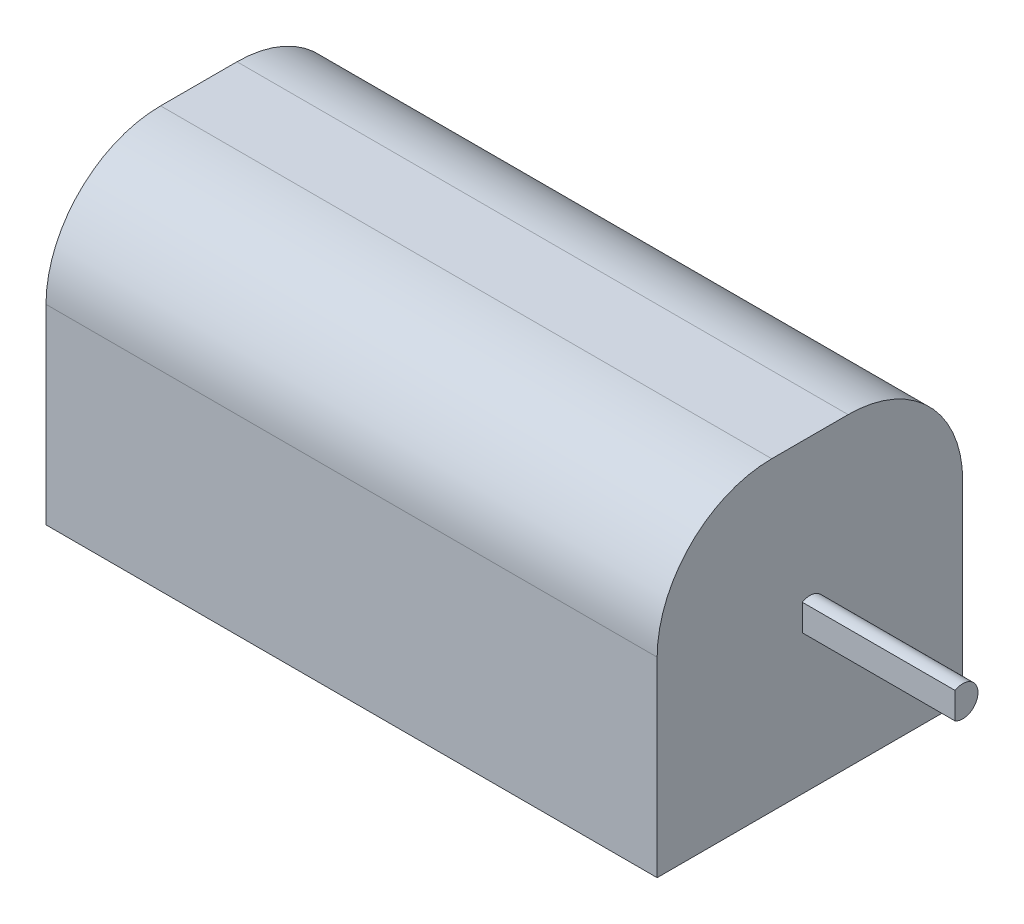
ISO-10303-21;
HEADER;
FILE_DESCRIPTION(('STEP AP214'),'2;1');
FILE_NAME('part.step','',(''),(''),'','','');
FILE_SCHEMA(('AUTOMOTIVE_DESIGN { 1 0 10303 214 1 1 1 1 }'));
ENDSEC;
DATA;
#1=APPLICATION_CONTEXT('core data for automotive mechanical design processes');
#2=APPLICATION_PROTOCOL_DEFINITION('international standard','automotive_design',2000,#1);
#3=PRODUCT_CONTEXT('',#1,'mechanical');
#4=PRODUCT('Part','Part','',(#3));
#5=PRODUCT_RELATED_PRODUCT_CATEGORY('part','',(#4));
#6=PRODUCT_DEFINITION_FORMATION('','',#4);
#7=PRODUCT_DEFINITION_CONTEXT('part definition',#1,'design');
#8=PRODUCT_DEFINITION('design','',#6,#7);
#9=PRODUCT_DEFINITION_SHAPE('','',#8);
#10=(LENGTH_UNIT() NAMED_UNIT(*) SI_UNIT(.MILLI.,.METRE.));
#11=(NAMED_UNIT(*) PLANE_ANGLE_UNIT() SI_UNIT($,.RADIAN.));
#12=(NAMED_UNIT(*) SI_UNIT($,.STERADIAN.) SOLID_ANGLE_UNIT());
#13=UNCERTAINTY_MEASURE_WITH_UNIT(LENGTH_MEASURE(1.E-05),#10,'distance_accuracy_value','');
#14=(GEOMETRIC_REPRESENTATION_CONTEXT(3) GLOBAL_UNCERTAINTY_ASSIGNED_CONTEXT((#13)) GLOBAL_UNIT_ASSIGNED_CONTEXT((#10,
#11,#12)) REPRESENTATION_CONTEXT('',''));
#15=CARTESIAN_POINT('',(0.,0.,0.));
#16=DIRECTION('',(0.,0.,1.));
#17=DIRECTION('',(1.,0.,0.));
#18=AXIS2_PLACEMENT_3D('',#15,#16,#17);
#19=CARTESIAN_POINT('',(40.,20.,20.));
#20=DIRECTION('',(-1.,0.,0.));
#21=DIRECTION('',(0.,0.,1.));
#22=AXIS2_PLACEMENT_3D('',#19,#20,#21);
#23=PLANE('',#22);
#24=DIRECTION('',(0.,-1.,0.));
#25=VECTOR('',#24,1.);
#26=CARTESIAN_POINT('',(40.,20.,1.));
#27=LINE('',#26,#25);
#28=CARTESIAN_POINT('',(40.,1.73205080756888,1.));
#29=VERTEX_POINT('',#28);
#30=CARTESIAN_POINT('',(40.,-1.73205080756888,1.));
#31=VERTEX_POINT('',#30);
#32=EDGE_CURVE('E114',#29,#31,#27,.T.);
#33=ORIENTED_EDGE('',*,*,#32,.F.);
#34=CARTESIAN_POINT('',(40.,0.,0.));
#35=DIRECTION('',(-1.,0.,0.));
#36=DIRECTION('',(0.,0.,1.));
#37=AXIS2_PLACEMENT_3D('',#34,#35,#36);
#38=CIRCLE('',#37,2.);
#39=EDGE_CURVE('E121',#29,#31,#38,.T.);
#40=ORIENTED_EDGE('',*,*,#39,.T.);
#41=EDGE_LOOP('',(#33,#40));
#42=FACE_BOUND('',#41,.T.);
#43=DIRECTION('',(0.,-1.,0.));
#44=VECTOR('',#43,1.);
#45=CARTESIAN_POINT('',(40.,20.,-20.));
#46=LINE('',#45,#44);
#47=CARTESIAN_POINT('',(40.,5.,-20.));
#48=VERTEX_POINT('',#47);
#49=CARTESIAN_POINT('',(40.,-20.,-20.));
#50=VERTEX_POINT('',#49);
#51=EDGE_CURVE('E150',#48,#50,#46,.T.);
#52=ORIENTED_EDGE('',*,*,#51,.F.);
#53=CARTESIAN_POINT('',(40.,5.,-5.));
#54=DIRECTION('',(-1.,0.,0.));
#55=DIRECTION('',(0.,0.,1.));
#56=AXIS2_PLACEMENT_3D('',#53,#54,#55);
#57=CIRCLE('',#56,15.);
#58=CARTESIAN_POINT('',(40.,20.,-5.));
#59=VERTEX_POINT('',#58);
#60=EDGE_CURVE('E45',#48,#59,#57,.F.);
#61=ORIENTED_EDGE('',*,*,#60,.T.);
#62=DIRECTION('',(0.,0.,-1.));
#63=VECTOR('',#62,1.);
#64=CARTESIAN_POINT('',(40.,20.,20.));
#65=LINE('',#64,#63);
#66=CARTESIAN_POINT('',(40.,20.,5.));
#67=VERTEX_POINT('',#66);
#68=EDGE_CURVE('E127',#67,#59,#65,.T.);
#69=ORIENTED_EDGE('',*,*,#68,.F.);
#70=CARTESIAN_POINT('',(40.,5.,5.));
#71=DIRECTION('',(-1.,0.,0.));
#72=DIRECTION('',(0.,0.,1.));
#73=AXIS2_PLACEMENT_3D('',#70,#71,#72);
#74=CIRCLE('',#73,15.);
#75=CARTESIAN_POINT('',(40.,5.,20.));
#76=VERTEX_POINT('',#75);
#77=EDGE_CURVE('E52',#67,#76,#74,.F.);
#78=ORIENTED_EDGE('',*,*,#77,.T.);
#79=DIRECTION('',(0.,-1.,0.));
#80=VECTOR('',#79,1.);
#81=CARTESIAN_POINT('',(40.,20.,20.));
#82=LINE('',#81,#80);
#83=CARTESIAN_POINT('',(40.,-20.,20.));
#84=VERTEX_POINT('',#83);
#85=EDGE_CURVE('E134',#76,#84,#82,.T.);
#86=ORIENTED_EDGE('',*,*,#85,.T.);
#87=DIRECTION('',(0.,0.,-1.));
#88=VECTOR('',#87,1.);
#89=CARTESIAN_POINT('',(40.,-20.,20.));
#90=LINE('',#89,#88);
#91=EDGE_CURVE('E125',#84,#50,#90,.T.);
#92=ORIENTED_EDGE('',*,*,#91,.T.);
#93=EDGE_LOOP('',(#52,#61,#69,#78,#86,#92));
#94=FACE_BOUND('',#93,.T.);
#95=ADVANCED_FACE('F37',(#42,#94),#23,.F.);
#96=CARTESIAN_POINT('',(-40.,20.,-20.));
#97=DIRECTION('',(0.,0.,1.));
#98=DIRECTION('',(1.,0.,0.));
#99=AXIS2_PLACEMENT_3D('',#96,#97,#98);
#100=PLANE('',#99);
#101=DIRECTION('',(0.,-1.,0.));
#102=VECTOR('',#101,1.);
#103=CARTESIAN_POINT('',(-40.,20.,-20.));
#104=LINE('',#103,#102);
#105=CARTESIAN_POINT('',(-40.,5.,-20.));
#106=VERTEX_POINT('',#105);
#107=CARTESIAN_POINT('',(-40.,-20.,-20.));
#108=VERTEX_POINT('',#107);
#109=EDGE_CURVE('E148',#106,#108,#104,.T.);
#110=ORIENTED_EDGE('',*,*,#109,.F.);
#111=DIRECTION('',(-1.,0.,0.));
#112=VECTOR('',#111,1.);
#113=CARTESIAN_POINT('',(-40.,5.,-20.));
#114=LINE('',#113,#112);
#115=EDGE_CURVE('E60',#106,#48,#114,.F.);
#116=ORIENTED_EDGE('',*,*,#115,.T.);
#117=ORIENTED_EDGE('',*,*,#51,.T.);
#118=DIRECTION('',(-1.,0.,0.));
#119=VECTOR('',#118,1.);
#120=CARTESIAN_POINT('',(-40.,-20.,-20.));
#121=LINE('',#120,#119);
#122=EDGE_CURVE('E137',#50,#108,#121,.T.);
#123=ORIENTED_EDGE('',*,*,#122,.T.);
#124=EDGE_LOOP('',(#110,#116,#117,#123));
#125=FACE_BOUND('',#124,.T.);
#126=ADVANCED_FACE('F173',(#125),#100,.F.);
#127=CARTESIAN_POINT('',(-40.,20.,20.));
#128=DIRECTION('',(1.,0.,0.));
#129=DIRECTION('',(0.,0.,-1.));
#130=AXIS2_PLACEMENT_3D('',#127,#128,#129);
#131=PLANE('',#130);
#132=DIRECTION('',(0.,0.,1.));
#133=VECTOR('',#132,1.);
#134=CARTESIAN_POINT('',(-40.,20.,20.));
#135=LINE('',#134,#133);
#136=CARTESIAN_POINT('',(-40.,20.,-5.));
#137=VERTEX_POINT('',#136);
#138=CARTESIAN_POINT('',(-40.,20.,5.));
#139=VERTEX_POINT('',#138);
#140=EDGE_CURVE('E130',#137,#139,#135,.T.);
#141=ORIENTED_EDGE('',*,*,#140,.F.);
#142=CARTESIAN_POINT('',(-40.,5.,-5.));
#143=DIRECTION('',(1.,0.,0.));
#144=DIRECTION('',(0.,0.,-1.));
#145=AXIS2_PLACEMENT_3D('',#142,#143,#144);
#146=CIRCLE('',#145,15.);
#147=EDGE_CURVE('E160',#137,#106,#146,.F.);
#148=ORIENTED_EDGE('',*,*,#147,.T.);
#149=ORIENTED_EDGE('',*,*,#109,.T.);
#150=DIRECTION('',(0.,0.,1.));
#151=VECTOR('',#150,1.);
#152=CARTESIAN_POINT('',(-40.,-20.,20.));
#153=LINE('',#152,#151);
#154=CARTESIAN_POINT('',(-40.,-20.,20.));
#155=VERTEX_POINT('',#154);
#156=EDGE_CURVE('E140',#108,#155,#153,.T.);
#157=ORIENTED_EDGE('',*,*,#156,.T.);
#158=DIRECTION('',(0.,-1.,0.));
#159=VECTOR('',#158,1.);
#160=CARTESIAN_POINT('',(-40.,20.,20.));
#161=LINE('',#160,#159);
#162=CARTESIAN_POINT('',(-40.,5.,20.));
#163=VERTEX_POINT('',#162);
#164=EDGE_CURVE('E146',#163,#155,#161,.T.);
#165=ORIENTED_EDGE('',*,*,#164,.F.);
#166=CARTESIAN_POINT('',(-40.,5.,5.));
#167=DIRECTION('',(1.,0.,0.));
#168=DIRECTION('',(0.,0.,-1.));
#169=AXIS2_PLACEMENT_3D('',#166,#167,#168);
#170=CIRCLE('',#169,15.);
#171=EDGE_CURVE('E158',#163,#139,#170,.F.);
#172=ORIENTED_EDGE('',*,*,#171,.T.);
#173=EDGE_LOOP('',(#141,#148,#149,#157,#165,#172));
#174=FACE_BOUND('',#173,.T.);
#175=ADVANCED_FACE('F172',(#174),#131,.F.);
#176=CARTESIAN_POINT('',(-40.,20.,20.));
#177=DIRECTION('',(0.,0.,-1.));
#178=DIRECTION('',(-1.,0.,0.));
#179=AXIS2_PLACEMENT_3D('',#176,#177,#178);
#180=PLANE('',#179);
#181=ORIENTED_EDGE('',*,*,#85,.F.);
#182=DIRECTION('',(1.,0.,0.));
#183=VECTOR('',#182,1.);
#184=CARTESIAN_POINT('',(-40.,5.,20.));
#185=LINE('',#184,#183);
#186=EDGE_CURVE('E11',#76,#163,#185,.F.);
#187=ORIENTED_EDGE('',*,*,#186,.T.);
#188=ORIENTED_EDGE('',*,*,#164,.T.);
#189=DIRECTION('',(1.,0.,0.));
#190=VECTOR('',#189,1.);
#191=CARTESIAN_POINT('',(-40.,-20.,20.));
#192=LINE('',#191,#190);
#193=EDGE_CURVE('E131',#155,#84,#192,.T.);
#194=ORIENTED_EDGE('',*,*,#193,.T.);
#195=EDGE_LOOP('',(#181,#187,#188,#194));
#196=FACE_BOUND('',#195,.T.);
#197=ADVANCED_FACE('F185',(#196),#180,.F.);
#198=CARTESIAN_POINT('',(0.,20.,0.));
#199=DIRECTION('',(0.,-1.,0.));
#200=DIRECTION('',(0.,0.,-1.));
#201=AXIS2_PLACEMENT_3D('',#198,#199,#200);
#202=PLANE('',#201);
#203=ORIENTED_EDGE('',*,*,#68,.T.);
#204=DIRECTION('',(-1.,0.,0.));
#205=VECTOR('',#204,1.);
#206=CARTESIAN_POINT('',(0.,20.,-5.));
#207=LINE('',#206,#205);
#208=EDGE_CURVE('E155',#59,#137,#207,.T.);
#209=ORIENTED_EDGE('',*,*,#208,.T.);
#210=ORIENTED_EDGE('',*,*,#140,.T.);
#211=DIRECTION('',(1.,0.,0.));
#212=VECTOR('',#211,1.);
#213=CARTESIAN_POINT('',(0.,20.,5.));
#214=LINE('',#213,#212);
#215=EDGE_CURVE('E152',#139,#67,#214,.T.);
#216=ORIENTED_EDGE('',*,*,#215,.T.);
#217=EDGE_LOOP('',(#203,#209,#210,#216));
#218=FACE_BOUND('',#217,.T.);
#219=ADVANCED_FACE('F167',(#218),#202,.F.);
#220=CARTESIAN_POINT('',(0.,-20.,0.));
#221=DIRECTION('',(0.,-1.,0.));
#222=DIRECTION('',(0.,0.,-1.));
#223=AXIS2_PLACEMENT_3D('',#220,#221,#222);
#224=PLANE('',#223);
#225=ORIENTED_EDGE('',*,*,#91,.F.);
#226=ORIENTED_EDGE('',*,*,#193,.F.);
#227=ORIENTED_EDGE('',*,*,#156,.F.);
#228=ORIENTED_EDGE('',*,*,#122,.F.);
#229=EDGE_LOOP('',(#225,#226,#227,#228));
#230=FACE_BOUND('',#229,.T.);
#231=ADVANCED_FACE('F179',(#230),#224,.T.);
#232=CARTESIAN_POINT('',(60.,0.,0.));
#233=DIRECTION('',(-1.,0.,0.));
#234=DIRECTION('',(0.,0.,1.));
#235=AXIS2_PLACEMENT_3D('',#232,#233,#234);
#236=CYLINDRICAL_SURFACE('',#235,2.);
#237=ORIENTED_EDGE('',*,*,#39,.F.);
#238=DIRECTION('',(-1.,0.,0.));
#239=VECTOR('',#238,1.);
#240=CARTESIAN_POINT('',(60.,1.73205080756888,1.));
#241=LINE('',#240,#239);
#242=CARTESIAN_POINT('',(60.,1.73205080756888,1.));
#243=VERTEX_POINT('',#242);
#244=EDGE_CURVE('E117',#243,#29,#241,.T.);
#245=ORIENTED_EDGE('',*,*,#244,.F.);
#246=CARTESIAN_POINT('',(60.,0.,0.));
#247=DIRECTION('',(-1.,0.,0.));
#248=DIRECTION('',(0.,0.,1.));
#249=AXIS2_PLACEMENT_3D('',#246,#247,#248);
#250=CIRCLE('',#249,2.);
#251=CARTESIAN_POINT('',(60.,-1.73205080756888,1.));
#252=VERTEX_POINT('',#251);
#253=EDGE_CURVE('E106',#243,#252,#250,.T.);
#254=ORIENTED_EDGE('',*,*,#253,.T.);
#255=DIRECTION('',(-1.,0.,0.));
#256=VECTOR('',#255,1.);
#257=CARTESIAN_POINT('',(60.,-1.73205080756888,1.));
#258=LINE('',#257,#256);
#259=EDGE_CURVE('E109',#252,#31,#258,.T.);
#260=ORIENTED_EDGE('',*,*,#259,.T.);
#261=EDGE_LOOP('',(#237,#245,#254,#260));
#262=FACE_BOUND('',#261,.T.);
#263=ADVANCED_FACE('F119',(#262),#236,.T.);
#264=CARTESIAN_POINT('',(60.,20.,1.));
#265=DIRECTION('',(0.,0.,-1.));
#266=DIRECTION('',(-1.,0.,0.));
#267=AXIS2_PLACEMENT_3D('',#264,#265,#266);
#268=PLANE('',#267);
#269=ORIENTED_EDGE('',*,*,#32,.T.);
#270=ORIENTED_EDGE('',*,*,#259,.F.);
#271=DIRECTION('',(0.,-1.,0.));
#272=VECTOR('',#271,1.);
#273=CARTESIAN_POINT('',(60.,20.,1.));
#274=LINE('',#273,#272);
#275=EDGE_CURVE('E102',#243,#252,#274,.T.);
#276=ORIENTED_EDGE('',*,*,#275,.F.);
#277=ORIENTED_EDGE('',*,*,#244,.T.);
#278=EDGE_LOOP('',(#269,#270,#276,#277));
#279=FACE_BOUND('',#278,.T.);
#280=ADVANCED_FACE('F113',(#279),#268,.F.);
#281=CARTESIAN_POINT('',(60.,0.,0.));
#282=DIRECTION('',(-1.,0.,0.));
#283=DIRECTION('',(0.,0.,1.));
#284=AXIS2_PLACEMENT_3D('',#281,#282,#283);
#285=PLANE('',#284);
#286=ORIENTED_EDGE('',*,*,#253,.F.);
#287=ORIENTED_EDGE('',*,*,#275,.T.);
#288=EDGE_LOOP('',(#286,#287));
#289=FACE_BOUND('',#288,.T.);
#290=ADVANCED_FACE('F104',(#289),#285,.F.);
#291=CARTESIAN_POINT('',(0.,5.,-5.));
#292=DIRECTION('',(-1.,0.,0.));
#293=DIRECTION('',(0.,0.,1.));
#294=AXIS2_PLACEMENT_3D('',#291,#292,#293);
#295=CYLINDRICAL_SURFACE('',#294,15.);
#296=ORIENTED_EDGE('',*,*,#60,.F.);
#297=ORIENTED_EDGE('',*,*,#115,.F.);
#298=ORIENTED_EDGE('',*,*,#147,.F.);
#299=ORIENTED_EDGE('',*,*,#208,.F.);
#300=EDGE_LOOP('',(#296,#297,#298,#299));
#301=FACE_BOUND('',#300,.T.);
#302=ADVANCED_FACE('F170',(#301),#295,.T.);
#303=CARTESIAN_POINT('',(0.,5.,5.));
#304=DIRECTION('',(1.,0.,0.));
#305=DIRECTION('',(0.,0.,-1.));
#306=AXIS2_PLACEMENT_3D('',#303,#304,#305);
#307=CYLINDRICAL_SURFACE('',#306,15.);
#308=ORIENTED_EDGE('',*,*,#171,.F.);
#309=ORIENTED_EDGE('',*,*,#186,.F.);
#310=ORIENTED_EDGE('',*,*,#77,.F.);
#311=ORIENTED_EDGE('',*,*,#215,.F.);
#312=EDGE_LOOP('',(#308,#309,#310,#311));
#313=FACE_BOUND('',#312,.T.);
#314=ADVANCED_FACE('F39',(#313),#307,.T.);
#315=CLOSED_SHELL('',(#95,#126,#175,#197,#219,#231,#263,#280,#290,#302,#314));
#316=MANIFOLD_SOLID_BREP('B2',#315);
#317=ADVANCED_BREP_SHAPE_REPRESENTATION('',(#18,#316),#14);
#318=SHAPE_DEFINITION_REPRESENTATION(#9,#317);
ENDSEC;
END-ISO-10303-21;
